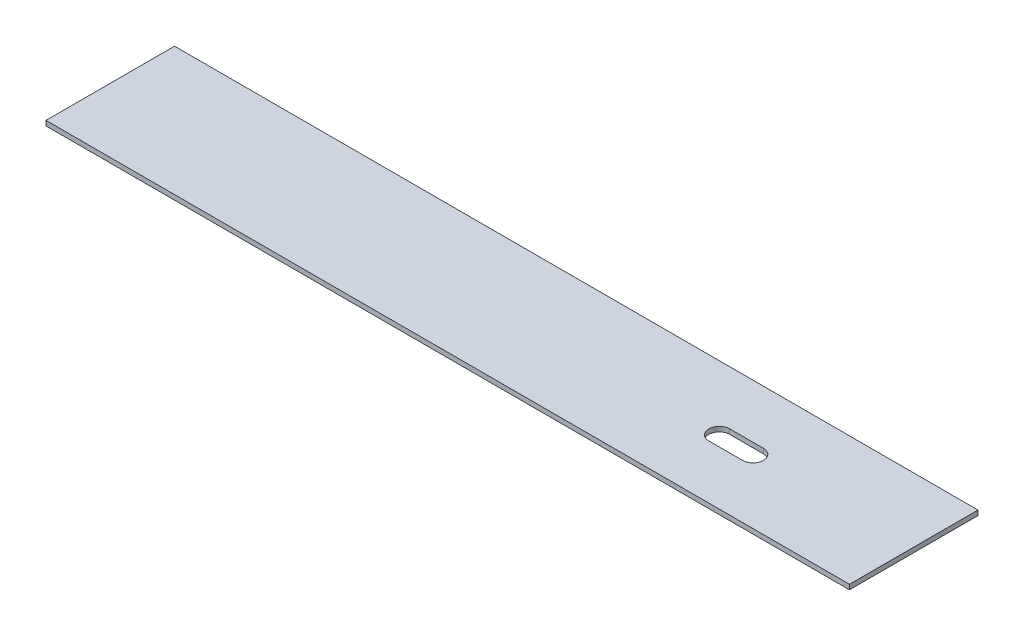
ISO-10303-21;
HEADER;
FILE_DESCRIPTION(('STEP AP214'),'2;1');
FILE_NAME('part.step','',(''),(''),'','','');
FILE_SCHEMA(('AUTOMOTIVE_DESIGN { 1 0 10303 214 1 1 1 1 }'));
ENDSEC;
DATA;
#1=APPLICATION_CONTEXT('core data for automotive mechanical design processes');
#2=APPLICATION_PROTOCOL_DEFINITION('international standard','automotive_design',2000,#1);
#3=PRODUCT_CONTEXT('',#1,'mechanical');
#4=PRODUCT('Part','Part','',(#3));
#5=PRODUCT_RELATED_PRODUCT_CATEGORY('part','',(#4));
#6=PRODUCT_DEFINITION_FORMATION('','',#4);
#7=PRODUCT_DEFINITION_CONTEXT('part definition',#1,'design');
#8=PRODUCT_DEFINITION('design','',#6,#7);
#9=PRODUCT_DEFINITION_SHAPE('','',#8);
#10=(LENGTH_UNIT() NAMED_UNIT(*) SI_UNIT(.MILLI.,.METRE.));
#11=(NAMED_UNIT(*) PLANE_ANGLE_UNIT() SI_UNIT($,.RADIAN.));
#12=(NAMED_UNIT(*) SI_UNIT($,.STERADIAN.) SOLID_ANGLE_UNIT());
#13=UNCERTAINTY_MEASURE_WITH_UNIT(LENGTH_MEASURE(1.E-05),#10,'distance_accuracy_value','');
#14=(GEOMETRIC_REPRESENTATION_CONTEXT(3) GLOBAL_UNCERTAINTY_ASSIGNED_CONTEXT((#13)) GLOBAL_UNIT_ASSIGNED_CONTEXT((#10,
#11,#12)) REPRESENTATION_CONTEXT('',''));
#15=CARTESIAN_POINT('',(0.,0.,0.));
#16=DIRECTION('',(0.,0.,1.));
#17=DIRECTION('',(1.,0.,0.));
#18=AXIS2_PLACEMENT_3D('',#15,#16,#17);
#19=CARTESIAN_POINT('',(250.,3.,-40.));
#20=DIRECTION('',(-1.,0.,0.));
#21=DIRECTION('',(0.,0.,1.));
#22=AXIS2_PLACEMENT_3D('',#19,#20,#21);
#23=PLANE('',#22);
#24=DIRECTION('',(0.,0.,-1.));
#25=VECTOR('',#24,1.);
#26=CARTESIAN_POINT('',(250.,0.,-40.));
#27=LINE('',#26,#25);
#28=CARTESIAN_POINT('',(250.,0.,40.));
#29=VERTEX_POINT('',#28);
#30=CARTESIAN_POINT('',(250.,0.,-40.));
#31=VERTEX_POINT('',#30);
#32=EDGE_CURVE('E131',#29,#31,#27,.T.);
#33=ORIENTED_EDGE('',*,*,#32,.T.);
#34=DIRECTION('',(0.,-1.,0.));
#35=VECTOR('',#34,1.);
#36=CARTESIAN_POINT('',(250.,3.,-40.));
#37=LINE('',#36,#35);
#38=CARTESIAN_POINT('',(250.,3.,-40.));
#39=VERTEX_POINT('',#38);
#40=EDGE_CURVE('E160',#39,#31,#37,.T.);
#41=ORIENTED_EDGE('',*,*,#40,.F.);
#42=DIRECTION('',(0.,0.,-1.));
#43=VECTOR('',#42,1.);
#44=CARTESIAN_POINT('',(250.,3.,-40.));
#45=LINE('',#44,#43);
#46=CARTESIAN_POINT('',(250.,3.,40.));
#47=VERTEX_POINT('',#46);
#48=EDGE_CURVE('E134',#47,#39,#45,.T.);
#49=ORIENTED_EDGE('',*,*,#48,.F.);
#50=DIRECTION('',(0.,-1.,0.));
#51=VECTOR('',#50,1.);
#52=CARTESIAN_POINT('',(250.,3.,40.));
#53=LINE('',#52,#51);
#54=EDGE_CURVE('E144',#47,#29,#53,.T.);
#55=ORIENTED_EDGE('',*,*,#54,.T.);
#56=EDGE_LOOP('',(#33,#41,#49,#55));
#57=FACE_BOUND('',#56,.T.);
#58=ADVANCED_FACE('F41',(#57),#23,.F.);
#59=CARTESIAN_POINT('',(-250.,3.,-40.));
#60=DIRECTION('',(0.,0.,1.));
#61=DIRECTION('',(1.,0.,0.));
#62=AXIS2_PLACEMENT_3D('',#59,#60,#61);
#63=PLANE('',#62);
#64=DIRECTION('',(-1.,0.,0.));
#65=VECTOR('',#64,1.);
#66=CARTESIAN_POINT('',(-250.,0.,-40.));
#67=LINE('',#66,#65);
#68=CARTESIAN_POINT('',(-250.,0.,-40.));
#69=VERTEX_POINT('',#68);
#70=EDGE_CURVE('E147',#31,#69,#67,.T.);
#71=ORIENTED_EDGE('',*,*,#70,.T.);
#72=DIRECTION('',(0.,-1.,0.));
#73=VECTOR('',#72,1.);
#74=CARTESIAN_POINT('',(-250.,3.,-40.));
#75=LINE('',#74,#73);
#76=CARTESIAN_POINT('',(-250.,3.,-40.));
#77=VERTEX_POINT('',#76);
#78=EDGE_CURVE('E157',#77,#69,#75,.T.);
#79=ORIENTED_EDGE('',*,*,#78,.F.);
#80=DIRECTION('',(-1.,0.,0.));
#81=VECTOR('',#80,1.);
#82=CARTESIAN_POINT('',(-250.,3.,-40.));
#83=LINE('',#82,#81);
#84=EDGE_CURVE('E137',#39,#77,#83,.T.);
#85=ORIENTED_EDGE('',*,*,#84,.F.);
#86=ORIENTED_EDGE('',*,*,#40,.T.);
#87=EDGE_LOOP('',(#71,#79,#85,#86));
#88=FACE_BOUND('',#87,.T.);
#89=ADVANCED_FACE('F184',(#88),#63,.F.);
#90=CARTESIAN_POINT('',(-250.,3.,-40.));
#91=DIRECTION('',(1.,0.,0.));
#92=DIRECTION('',(0.,0.,-1.));
#93=AXIS2_PLACEMENT_3D('',#90,#91,#92);
#94=PLANE('',#93);
#95=DIRECTION('',(0.,0.,1.));
#96=VECTOR('',#95,1.);
#97=CARTESIAN_POINT('',(-250.,0.,-40.));
#98=LINE('',#97,#96);
#99=CARTESIAN_POINT('',(-250.,0.,40.));
#100=VERTEX_POINT('',#99);
#101=EDGE_CURVE('E149',#69,#100,#98,.T.);
#102=ORIENTED_EDGE('',*,*,#101,.T.);
#103=DIRECTION('',(0.,-1.,0.));
#104=VECTOR('',#103,1.);
#105=CARTESIAN_POINT('',(-250.,3.,40.));
#106=LINE('',#105,#104);
#107=CARTESIAN_POINT('',(-250.,3.,40.));
#108=VERTEX_POINT('',#107);
#109=EDGE_CURVE('E154',#108,#100,#106,.T.);
#110=ORIENTED_EDGE('',*,*,#109,.F.);
#111=DIRECTION('',(0.,0.,1.));
#112=VECTOR('',#111,1.);
#113=CARTESIAN_POINT('',(-250.,3.,-40.));
#114=LINE('',#113,#112);
#115=EDGE_CURVE('E140',#77,#108,#114,.T.);
#116=ORIENTED_EDGE('',*,*,#115,.F.);
#117=ORIENTED_EDGE('',*,*,#78,.T.);
#118=EDGE_LOOP('',(#102,#110,#116,#117));
#119=FACE_BOUND('',#118,.T.);
#120=ADVANCED_FACE('F189',(#119),#94,.F.);
#121=CARTESIAN_POINT('',(-250.,3.,40.));
#122=DIRECTION('',(0.,0.,-1.));
#123=DIRECTION('',(-1.,0.,0.));
#124=AXIS2_PLACEMENT_3D('',#121,#122,#123);
#125=PLANE('',#124);
#126=DIRECTION('',(1.,0.,0.));
#127=VECTOR('',#126,1.);
#128=CARTESIAN_POINT('',(-250.,0.,40.));
#129=LINE('',#128,#127);
#130=EDGE_CURVE('E138',#100,#29,#129,.T.);
#131=ORIENTED_EDGE('',*,*,#130,.T.);
#132=ORIENTED_EDGE('',*,*,#54,.F.);
#133=DIRECTION('',(1.,0.,0.));
#134=VECTOR('',#133,1.);
#135=CARTESIAN_POINT('',(-250.,3.,40.));
#136=LINE('',#135,#134);
#137=EDGE_CURVE('E142',#108,#47,#136,.T.);
#138=ORIENTED_EDGE('',*,*,#137,.F.);
#139=ORIENTED_EDGE('',*,*,#109,.T.);
#140=EDGE_LOOP('',(#131,#132,#138,#139));
#141=FACE_BOUND('',#140,.T.);
#142=ADVANCED_FACE('F202',(#141),#125,.F.);
#143=CARTESIAN_POINT('',(0.,3.,0.));
#144=DIRECTION('',(0.,1.,0.));
#145=DIRECTION('',(0.,0.,1.));
#146=AXIS2_PLACEMENT_3D('',#143,#144,#145);
#147=PLANE('',#146);
#148=CARTESIAN_POINT('',(129.,3.,0.));
#149=DIRECTION('',(0.,1.,0.));
#150=DIRECTION('',(0.,0.,1.));
#151=AXIS2_PLACEMENT_3D('',#148,#149,#150);
#152=CIRCLE('',#151,6.49999999999998);
#153=CARTESIAN_POINT('',(129.,3.,-6.49999999999998));
#154=VERTEX_POINT('',#153);
#155=CARTESIAN_POINT('',(129.,3.,6.49999999999998));
#156=VERTEX_POINT('',#155);
#157=EDGE_CURVE('E55',#154,#156,#152,.T.);
#158=ORIENTED_EDGE('',*,*,#157,.F.);
#159=DIRECTION('',(-1.,0.,0.));
#160=VECTOR('',#159,1.);
#161=CARTESIAN_POINT('',(129.,3.,-6.49999999999998));
#162=LINE('',#161,#160);
#163=CARTESIAN_POINT('',(150.,3.,-6.49999999999998));
#164=VERTEX_POINT('',#163);
#165=EDGE_CURVE('E124',#164,#154,#162,.T.);
#166=ORIENTED_EDGE('',*,*,#165,.F.);
#167=CARTESIAN_POINT('',(150.,3.,0.));
#168=DIRECTION('',(0.,1.,0.));
#169=DIRECTION('',(0.,0.,1.));
#170=AXIS2_PLACEMENT_3D('',#167,#168,#169);
#171=CIRCLE('',#170,6.49999999999998);
#172=CARTESIAN_POINT('',(150.,3.,6.49999999999996));
#173=VERTEX_POINT('',#172);
#174=EDGE_CURVE('E108',#173,#164,#171,.T.);
#175=ORIENTED_EDGE('',*,*,#174,.F.);
#176=DIRECTION('',(1.,0.,0.));
#177=VECTOR('',#176,1.);
#178=CARTESIAN_POINT('',(129.,3.,6.49999999999998));
#179=LINE('',#178,#177);
#180=EDGE_CURVE('E117',#156,#173,#179,.T.);
#181=ORIENTED_EDGE('',*,*,#180,.F.);
#182=EDGE_LOOP('',(#158,#166,#175,#181));
#183=FACE_BOUND('',#182,.T.);
#184=ORIENTED_EDGE('',*,*,#48,.T.);
#185=ORIENTED_EDGE('',*,*,#84,.T.);
#186=ORIENTED_EDGE('',*,*,#115,.T.);
#187=ORIENTED_EDGE('',*,*,#137,.T.);
#188=EDGE_LOOP('',(#184,#185,#186,#187));
#189=FACE_BOUND('',#188,.T.);
#190=ADVANCED_FACE('F121',(#183,#189),#147,.T.);
#191=CARTESIAN_POINT('',(0.,0.,0.));
#192=DIRECTION('',(0.,1.,0.));
#193=DIRECTION('',(0.,0.,1.));
#194=AXIS2_PLACEMENT_3D('',#191,#192,#193);
#195=PLANE('',#194);
#196=DIRECTION('',(-1.,0.,0.));
#197=VECTOR('',#196,1.);
#198=CARTESIAN_POINT('',(0.,0.,-6.49999999999998));
#199=LINE('',#198,#197);
#200=CARTESIAN_POINT('',(150.,0.,-6.49999999999998));
#201=VERTEX_POINT('',#200);
#202=CARTESIAN_POINT('',(129.,0.,-6.49999999999998));
#203=VERTEX_POINT('',#202);
#204=EDGE_CURVE('E48',#201,#203,#199,.T.);
#205=ORIENTED_EDGE('',*,*,#204,.T.);
#206=CARTESIAN_POINT('',(129.,0.,0.));
#207=DIRECTION('',(0.,1.,0.));
#208=DIRECTION('',(0.,0.,1.));
#209=AXIS2_PLACEMENT_3D('',#206,#207,#208);
#210=CIRCLE('',#209,6.49999999999998);
#211=CARTESIAN_POINT('',(129.,0.,6.49999999999998));
#212=VERTEX_POINT('',#211);
#213=EDGE_CURVE('E11',#203,#212,#210,.T.);
#214=ORIENTED_EDGE('',*,*,#213,.T.);
#215=DIRECTION('',(1.,0.,0.));
#216=VECTOR('',#215,1.);
#217=CARTESIAN_POINT('',(0.,0.,6.49999999999998));
#218=LINE('',#217,#216);
#219=CARTESIAN_POINT('',(150.,0.,6.49999999999998));
#220=VERTEX_POINT('',#219);
#221=EDGE_CURVE('E163',#212,#220,#218,.T.);
#222=ORIENTED_EDGE('',*,*,#221,.T.);
#223=CARTESIAN_POINT('',(150.,0.,0.));
#224=DIRECTION('',(0.,1.,0.));
#225=DIRECTION('',(0.,0.,1.));
#226=AXIS2_PLACEMENT_3D('',#223,#224,#225);
#227=CIRCLE('',#226,6.49999999999998);
#228=EDGE_CURVE('E111',#220,#201,#227,.T.);
#229=ORIENTED_EDGE('',*,*,#228,.T.);
#230=EDGE_LOOP('',(#205,#214,#222,#229));
#231=FACE_BOUND('',#230,.T.);
#232=ORIENTED_EDGE('',*,*,#32,.F.);
#233=ORIENTED_EDGE('',*,*,#130,.F.);
#234=ORIENTED_EDGE('',*,*,#101,.F.);
#235=ORIENTED_EDGE('',*,*,#70,.F.);
#236=EDGE_LOOP('',(#232,#233,#234,#235));
#237=FACE_BOUND('',#236,.T.);
#238=ADVANCED_FACE('F167',(#231,#237),#195,.F.);
#239=CARTESIAN_POINT('',(129.,-7.,0.));
#240=DIRECTION('',(0.,1.,0.));
#241=DIRECTION('',(0.,0.,1.));
#242=AXIS2_PLACEMENT_3D('',#239,#240,#241);
#243=CYLINDRICAL_SURFACE('',#242,6.49999999999998);
#244=DIRECTION('',(0.,1.,0.));
#245=VECTOR('',#244,1.);
#246=CARTESIAN_POINT('',(129.,-7.,-6.49999999999998));
#247=LINE('',#246,#245);
#248=EDGE_CURVE('E129',#203,#154,#247,.T.);
#249=ORIENTED_EDGE('',*,*,#248,.T.);
#250=ORIENTED_EDGE('',*,*,#157,.T.);
#251=DIRECTION('',(0.,1.,0.));
#252=VECTOR('',#251,1.);
#253=CARTESIAN_POINT('',(129.,-7.,6.49999999999998));
#254=LINE('',#253,#252);
#255=EDGE_CURVE('E114',#212,#156,#254,.T.);
#256=ORIENTED_EDGE('',*,*,#255,.F.);
#257=ORIENTED_EDGE('',*,*,#213,.F.);
#258=EDGE_LOOP('',(#249,#250,#256,#257));
#259=FACE_BOUND('',#258,.T.);
#260=ADVANCED_FACE('F172',(#259),#243,.F.);
#261=CARTESIAN_POINT('',(129.,-7.,-6.49999999999998));
#262=DIRECTION('',(0.,0.,-1.));
#263=DIRECTION('',(-1.,0.,0.));
#264=AXIS2_PLACEMENT_3D('',#261,#262,#263);
#265=PLANE('',#264);
#266=DIRECTION('',(0.,1.,0.));
#267=VECTOR('',#266,1.);
#268=CARTESIAN_POINT('',(150.,-7.,-6.49999999999998));
#269=LINE('',#268,#267);
#270=EDGE_CURVE('E113',#201,#164,#269,.T.);
#271=ORIENTED_EDGE('',*,*,#270,.T.);
#272=ORIENTED_EDGE('',*,*,#165,.T.);
#273=ORIENTED_EDGE('',*,*,#248,.F.);
#274=ORIENTED_EDGE('',*,*,#204,.F.);
#275=EDGE_LOOP('',(#271,#272,#273,#274));
#276=FACE_BOUND('',#275,.T.);
#277=ADVANCED_FACE('F171',(#276),#265,.F.);
#278=CARTESIAN_POINT('',(150.,-7.,0.));
#279=DIRECTION('',(0.,1.,0.));
#280=DIRECTION('',(0.,0.,1.));
#281=AXIS2_PLACEMENT_3D('',#278,#279,#280);
#282=CYLINDRICAL_SURFACE('',#281,6.49999999999998);
#283=DIRECTION('',(0.,1.,0.));
#284=VECTOR('',#283,1.);
#285=CARTESIAN_POINT('',(150.,-7.,6.49999999999996));
#286=LINE('',#285,#284);
#287=EDGE_CURVE('E63',#220,#173,#286,.T.);
#288=ORIENTED_EDGE('',*,*,#287,.T.);
#289=ORIENTED_EDGE('',*,*,#174,.T.);
#290=ORIENTED_EDGE('',*,*,#270,.F.);
#291=ORIENTED_EDGE('',*,*,#228,.F.);
#292=EDGE_LOOP('',(#288,#289,#290,#291));
#293=FACE_BOUND('',#292,.T.);
#294=ADVANCED_FACE('F105',(#293),#282,.F.);
#295=CARTESIAN_POINT('',(129.,-7.,6.49999999999998));
#296=DIRECTION('',(0.,0.,1.));
#297=DIRECTION('',(1.,0.,0.));
#298=AXIS2_PLACEMENT_3D('',#295,#296,#297);
#299=PLANE('',#298);
#300=ORIENTED_EDGE('',*,*,#255,.T.);
#301=ORIENTED_EDGE('',*,*,#180,.T.);
#302=ORIENTED_EDGE('',*,*,#287,.F.);
#303=ORIENTED_EDGE('',*,*,#221,.F.);
#304=EDGE_LOOP('',(#300,#301,#302,#303));
#305=FACE_BOUND('',#304,.T.);
#306=ADVANCED_FACE('F118',(#305),#299,.F.);
#307=CLOSED_SHELL('',(#58,#89,#120,#142,#190,#238,#260,#277,#294,#306));
#308=MANIFOLD_SOLID_BREP('B2',#307);
#309=ADVANCED_BREP_SHAPE_REPRESENTATION('',(#18,#308),#14);
#310=SHAPE_DEFINITION_REPRESENTATION(#9,#309);
ENDSEC;
END-ISO-10303-21;
